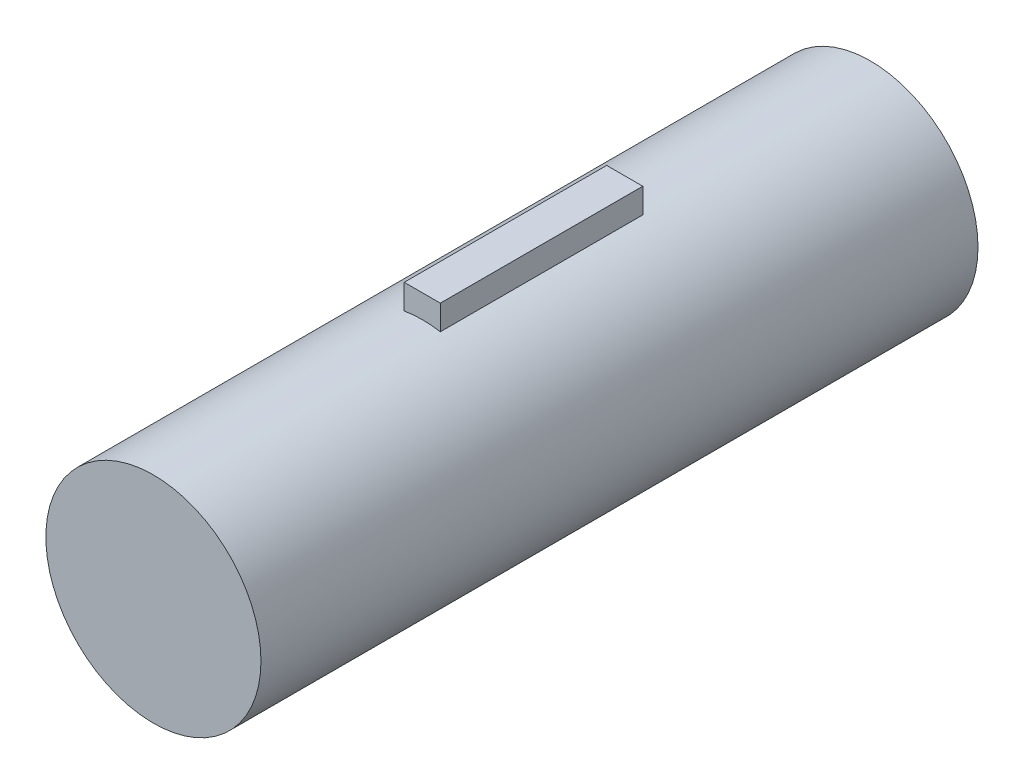
ISO-10303-21;
HEADER;
FILE_DESCRIPTION(('STEP AP214'),'2;1');
FILE_NAME('part.step','',(''),(''),'','','');
FILE_SCHEMA(('AUTOMOTIVE_DESIGN { 1 0 10303 214 1 1 1 1 }'));
ENDSEC;
DATA;
#1=APPLICATION_CONTEXT('core data for automotive mechanical design processes');
#2=APPLICATION_PROTOCOL_DEFINITION('international standard','automotive_design',2000,#1);
#3=PRODUCT_CONTEXT('',#1,'mechanical');
#4=PRODUCT('Part','Part','',(#3));
#5=PRODUCT_RELATED_PRODUCT_CATEGORY('part','',(#4));
#6=PRODUCT_DEFINITION_FORMATION('','',#4);
#7=PRODUCT_DEFINITION_CONTEXT('part definition',#1,'design');
#8=PRODUCT_DEFINITION('design','',#6,#7);
#9=PRODUCT_DEFINITION_SHAPE('','',#8);
#10=(LENGTH_UNIT() NAMED_UNIT(*) SI_UNIT(.MILLI.,.METRE.));
#11=(NAMED_UNIT(*) PLANE_ANGLE_UNIT() SI_UNIT($,.RADIAN.));
#12=(NAMED_UNIT(*) SI_UNIT($,.STERADIAN.) SOLID_ANGLE_UNIT());
#13=UNCERTAINTY_MEASURE_WITH_UNIT(LENGTH_MEASURE(1.E-05),#10,'distance_accuracy_value','');
#14=(GEOMETRIC_REPRESENTATION_CONTEXT(3) GLOBAL_UNCERTAINTY_ASSIGNED_CONTEXT((#13)) GLOBAL_UNIT_ASSIGNED_CONTEXT((#10,
#11,#12)) REPRESENTATION_CONTEXT('',''));
#15=CARTESIAN_POINT('',(0.,0.,0.));
#16=DIRECTION('',(0.,0.,1.));
#17=DIRECTION('',(1.,0.,0.));
#18=AXIS2_PLACEMENT_3D('',#15,#16,#17);
#19=CARTESIAN_POINT('',(0.,0.,-40.));
#20=DIRECTION('',(0.,0.,1.));
#21=DIRECTION('',(1.,0.,0.));
#22=AXIS2_PLACEMENT_3D('',#19,#20,#21);
#23=CYLINDRICAL_SURFACE('',#22,6.);
#24=CARTESIAN_POINT('',(0.,0.,-14.9986577468155));
#25=DIRECTION('',(0.,0.,1.));
#26=DIRECTION('',(1.,0.,0.));
#27=AXIS2_PLACEMENT_3D('',#24,#25,#26);
#28=CIRCLE('',#27,6.);
#29=CARTESIAN_POINT('',(1.00652479451924,5.91497318987422,-14.9986577468155));
#30=VERTEX_POINT('',#29);
#31=CARTESIAN_POINT('',(-1.00652479451924,5.91497318987422,-14.9986577468155));
#32=VERTEX_POINT('',#31);
#33=EDGE_CURVE('E53',#30,#32,#28,.T.);
#34=ORIENTED_EDGE('',*,*,#33,.T.);
#35=DIRECTION('',(0.,0.,1.));
#36=VECTOR('',#35,1.);
#37=CARTESIAN_POINT('',(-1.00652479451924,5.91497318996612,-40.));
#38=LINE('',#37,#36);
#39=CARTESIAN_POINT('',(-1.00652479451924,5.91497318987422,-26.2926655911144));
#40=VERTEX_POINT('',#39);
#41=EDGE_CURVE('E73',#32,#40,#38,.F.);
#42=ORIENTED_EDGE('',*,*,#41,.T.);
#43=CARTESIAN_POINT('',(0.,0.,-26.2926655911144));
#44=DIRECTION('',(0.,0.,-1.));
#45=DIRECTION('',(-1.,0.,0.));
#46=AXIS2_PLACEMENT_3D('',#43,#44,#45);
#47=CIRCLE('',#46,6.);
#48=CARTESIAN_POINT('',(1.00652479451924,5.91497318996612,-26.2926655911144));
#49=VERTEX_POINT('',#48);
#50=EDGE_CURVE('E104',#40,#49,#47,.T.);
#51=ORIENTED_EDGE('',*,*,#50,.T.);
#52=DIRECTION('',(0.,0.,1.));
#53=VECTOR('',#52,1.);
#54=CARTESIAN_POINT('',(1.00652479451924,5.91497318996612,-40.));
#55=LINE('',#54,#53);
#56=EDGE_CURVE('E45',#49,#30,#55,.T.);
#57=ORIENTED_EDGE('',*,*,#56,.T.);
#58=EDGE_LOOP('',(#34,#42,#51,#57));
#59=FACE_BOUND('',#58,.T.);
#60=CARTESIAN_POINT('',(0.,0.,-40.));
#61=DIRECTION('',(0.,0.,1.));
#62=DIRECTION('',(1.,0.,0.));
#63=AXIS2_PLACEMENT_3D('',#60,#61,#62);
#64=CIRCLE('',#63,6.);
#65=CARTESIAN_POINT('',(6.,0.,-40.));
#66=VERTEX_POINT('',#65);
#67=EDGE_CURVE('E11',#66,#66,#64,.T.);
#68=ORIENTED_EDGE('',*,*,#67,.T.);
#69=EDGE_LOOP('',(#68));
#70=FACE_BOUND('',#69,.T.);
#71=CARTESIAN_POINT('',(0.,0.,0.));
#72=DIRECTION('',(0.,0.,1.));
#73=DIRECTION('',(1.,0.,0.));
#74=AXIS2_PLACEMENT_3D('',#71,#72,#73);
#75=CIRCLE('',#74,6.);
#76=CARTESIAN_POINT('',(6.,0.,0.));
#77=VERTEX_POINT('',#76);
#78=EDGE_CURVE('E34',#77,#77,#75,.T.);
#79=ORIENTED_EDGE('',*,*,#78,.F.);
#80=EDGE_LOOP('',(#79));
#81=FACE_BOUND('',#80,.T.);
#82=ADVANCED_FACE('F31',(#59,#70,#81),#23,.T.);
#83=CARTESIAN_POINT('',(0.,0.,-40.));
#84=DIRECTION('',(0.,0.,1.));
#85=DIRECTION('',(1.,0.,0.));
#86=AXIS2_PLACEMENT_3D('',#83,#84,#85);
#87=PLANE('',#86);
#88=ORIENTED_EDGE('',*,*,#67,.F.);
#89=EDGE_LOOP('',(#88));
#90=FACE_BOUND('',#89,.T.);
#91=ADVANCED_FACE('F111',(#90),#87,.F.);
#92=CARTESIAN_POINT('',(0.,0.,0.));
#93=DIRECTION('',(0.,0.,1.));
#94=DIRECTION('',(1.,0.,0.));
#95=AXIS2_PLACEMENT_3D('',#92,#93,#94);
#96=PLANE('',#95);
#97=ORIENTED_EDGE('',*,*,#78,.T.);
#98=EDGE_LOOP('',(#97));
#99=FACE_BOUND('',#98,.T.);
#100=ADVANCED_FACE('F108',(#99),#96,.T.);
#101=CARTESIAN_POINT('',(1.00652479451924,-500000.,-14.9986577468155));
#102=DIRECTION('',(1.,0.,0.));
#103=DIRECTION('',(0.,0.,-1.));
#104=AXIS2_PLACEMENT_3D('',#101,#102,#103);
#105=PLANE('',#104);
#106=ORIENTED_EDGE('',*,*,#56,.F.);
#107=DIRECTION('',(0.,1.,0.));
#108=VECTOR('',#107,1.);
#109=CARTESIAN_POINT('',(1.00652479451924,-500000.,-26.2926655911144));
#110=LINE('',#109,#108);
#111=CARTESIAN_POINT('',(1.00652479451924,7.3,-26.2926655911144));
#112=VERTEX_POINT('',#111);
#113=EDGE_CURVE('E100',#49,#112,#110,.T.);
#114=ORIENTED_EDGE('',*,*,#113,.T.);
#115=DIRECTION('',(0.,0.,-1.));
#116=VECTOR('',#115,1.);
#117=CARTESIAN_POINT('',(1.00652479451924,7.3,-14.9986577468155));
#118=LINE('',#117,#116);
#119=CARTESIAN_POINT('',(1.00652479451924,7.3,-14.9986577468155));
#120=VERTEX_POINT('',#119);
#121=EDGE_CURVE('E91',#120,#112,#118,.T.);
#122=ORIENTED_EDGE('',*,*,#121,.F.);
#123=DIRECTION('',(0.,1.,0.));
#124=VECTOR('',#123,1.);
#125=CARTESIAN_POINT('',(1.00652479451924,-500000.,-14.9986577468155));
#126=LINE('',#125,#124);
#127=EDGE_CURVE('E74',#30,#120,#126,.T.);
#128=ORIENTED_EDGE('',*,*,#127,.F.);
#129=EDGE_LOOP('',(#106,#114,#122,#128));
#130=FACE_BOUND('',#129,.T.);
#131=ADVANCED_FACE('F120',(#130),#105,.T.);
#132=CARTESIAN_POINT('',(0.,-500000.,-14.9986577468155));
#133=DIRECTION('',(0.,0.,1.));
#134=DIRECTION('',(1.,0.,0.));
#135=AXIS2_PLACEMENT_3D('',#132,#133,#134);
#136=PLANE('',#135);
#137=ORIENTED_EDGE('',*,*,#33,.F.);
#138=ORIENTED_EDGE('',*,*,#127,.T.);
#139=DIRECTION('',(1.,0.,0.));
#140=VECTOR('',#139,1.);
#141=CARTESIAN_POINT('',(-1.00652479451924,7.3,-14.9986577468155));
#142=LINE('',#141,#140);
#143=CARTESIAN_POINT('',(-1.00652479451924,7.3,-14.9986577468155));
#144=VERTEX_POINT('',#143);
#145=EDGE_CURVE('E81',#144,#120,#142,.T.);
#146=ORIENTED_EDGE('',*,*,#145,.F.);
#147=DIRECTION('',(0.,-1.,0.));
#148=VECTOR('',#147,1.);
#149=CARTESIAN_POINT('',(-1.00652479451924,7.3,-14.9986577468155));
#150=LINE('',#149,#148);
#151=EDGE_CURVE('E78',#144,#32,#150,.T.);
#152=ORIENTED_EDGE('',*,*,#151,.T.);
#153=EDGE_LOOP('',(#137,#138,#146,#152));
#154=FACE_BOUND('',#153,.T.);
#155=ADVANCED_FACE('F79',(#154),#136,.T.);
#156=CARTESIAN_POINT('',(1.00652479451924,-500000.,-26.2926655911144));
#157=DIRECTION('',(0.,0.,-1.));
#158=DIRECTION('',(-1.,0.,0.));
#159=AXIS2_PLACEMENT_3D('',#156,#157,#158);
#160=PLANE('',#159);
#161=ORIENTED_EDGE('',*,*,#50,.F.);
#162=DIRECTION('',(0.,-1.,0.));
#163=VECTOR('',#162,1.);
#164=CARTESIAN_POINT('',(-1.00652479451924,7.3,-26.2926655911144));
#165=LINE('',#164,#163);
#166=CARTESIAN_POINT('',(-1.00652479451924,7.3,-26.2926655911144));
#167=VERTEX_POINT('',#166);
#168=EDGE_CURVE('E84',#167,#40,#165,.T.);
#169=ORIENTED_EDGE('',*,*,#168,.F.);
#170=DIRECTION('',(-1.,0.,0.));
#171=VECTOR('',#170,1.);
#172=CARTESIAN_POINT('',(1.00652479451924,7.3,-26.2926655911144));
#173=LINE('',#172,#171);
#174=EDGE_CURVE('E96',#112,#167,#173,.T.);
#175=ORIENTED_EDGE('',*,*,#174,.F.);
#176=ORIENTED_EDGE('',*,*,#113,.F.);
#177=EDGE_LOOP('',(#161,#169,#175,#176));
#178=FACE_BOUND('',#177,.T.);
#179=ADVANCED_FACE('F121',(#178),#160,.T.);
#180=CARTESIAN_POINT('',(-1.00652479451924,7.3,-26.2926655911144));
#181=DIRECTION('',(1.,0.,0.));
#182=DIRECTION('',(0.,0.,-1.));
#183=AXIS2_PLACEMENT_3D('',#180,#181,#182);
#184=PLANE('',#183);
#185=ORIENTED_EDGE('',*,*,#168,.T.);
#186=ORIENTED_EDGE('',*,*,#41,.F.);
#187=ORIENTED_EDGE('',*,*,#151,.F.);
#188=DIRECTION('',(0.,0.,1.));
#189=VECTOR('',#188,1.);
#190=CARTESIAN_POINT('',(-1.00652479451924,7.3,-26.2926655911144));
#191=LINE('',#190,#189);
#192=EDGE_CURVE('E85',#167,#144,#191,.T.);
#193=ORIENTED_EDGE('',*,*,#192,.F.);
#194=EDGE_LOOP('',(#185,#186,#187,#193));
#195=FACE_BOUND('',#194,.T.);
#196=ADVANCED_FACE('F88',(#195),#184,.F.);
#197=CARTESIAN_POINT('',(1.00652479451924,7.3,-14.9986577468155));
#198=DIRECTION('',(0.,1.,0.));
#199=DIRECTION('',(0.,0.,1.));
#200=AXIS2_PLACEMENT_3D('',#197,#198,#199);
#201=PLANE('',#200);
#202=ORIENTED_EDGE('',*,*,#145,.T.);
#203=ORIENTED_EDGE('',*,*,#121,.T.);
#204=ORIENTED_EDGE('',*,*,#174,.T.);
#205=ORIENTED_EDGE('',*,*,#192,.T.);
#206=EDGE_LOOP('',(#202,#203,#204,#205));
#207=FACE_BOUND('',#206,.T.);
#208=ADVANCED_FACE('F133',(#207),#201,.T.);
#209=CLOSED_SHELL('',(#82,#91,#100,#131,#155,#179,#196,#208));
#210=MANIFOLD_SOLID_BREP('B2',#209);
#211=ADVANCED_BREP_SHAPE_REPRESENTATION('',(#18,#210),#14);
#212=SHAPE_DEFINITION_REPRESENTATION(#9,#211);
ENDSEC;
END-ISO-10303-21;
